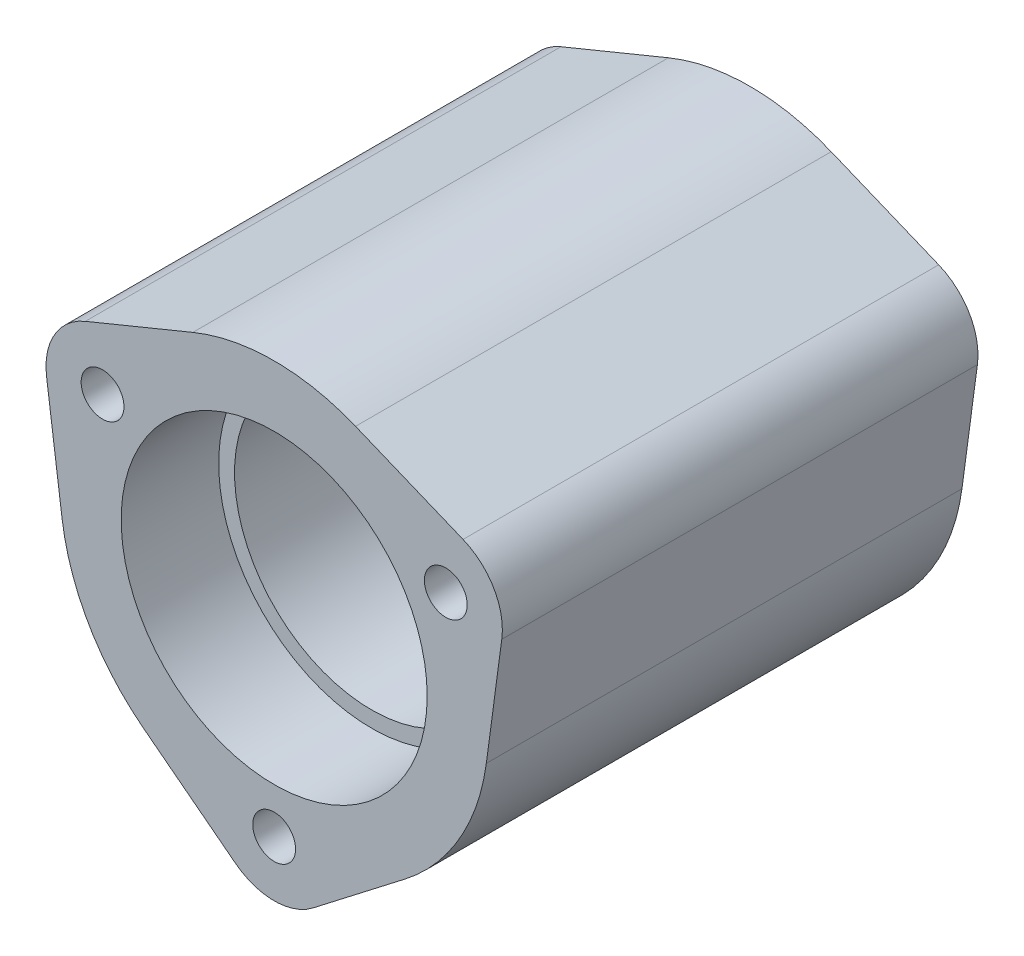
ISO-10303-21;
HEADER;
FILE_DESCRIPTION(('STEP AP214'),'2;1');
FILE_NAME('part.step','',(''),(''),'','','');
FILE_SCHEMA(('AUTOMOTIVE_DESIGN { 1 0 10303 214 1 1 1 1 }'));
ENDSEC;
DATA;
#1=APPLICATION_CONTEXT('core data for automotive mechanical design processes');
#2=APPLICATION_PROTOCOL_DEFINITION('international standard','automotive_design',2000,#1);
#3=PRODUCT_CONTEXT('',#1,'mechanical');
#4=PRODUCT('Part','Part','',(#3));
#5=PRODUCT_RELATED_PRODUCT_CATEGORY('part','',(#4));
#6=PRODUCT_DEFINITION_FORMATION('','',#4);
#7=PRODUCT_DEFINITION_CONTEXT('part definition',#1,'design');
#8=PRODUCT_DEFINITION('design','',#6,#7);
#9=PRODUCT_DEFINITION_SHAPE('','',#8);
#10=(LENGTH_UNIT() NAMED_UNIT(*) SI_UNIT(.MILLI.,.METRE.));
#11=(NAMED_UNIT(*) PLANE_ANGLE_UNIT() SI_UNIT($,.RADIAN.));
#12=(NAMED_UNIT(*) SI_UNIT($,.STERADIAN.) SOLID_ANGLE_UNIT());
#13=UNCERTAINTY_MEASURE_WITH_UNIT(LENGTH_MEASURE(1.E-05),#10,'distance_accuracy_value','');
#14=(GEOMETRIC_REPRESENTATION_CONTEXT(3) GLOBAL_UNCERTAINTY_ASSIGNED_CONTEXT((#13)) GLOBAL_UNIT_ASSIGNED_CONTEXT((#10,
#11,#12)) REPRESENTATION_CONTEXT('',''));
#15=CARTESIAN_POINT('',(0.,0.,0.));
#16=DIRECTION('',(0.,0.,1.));
#17=DIRECTION('',(1.,0.,0.));
#18=AXIS2_PLACEMENT_3D('',#15,#16,#17);
#19=CARTESIAN_POINT('',(0.,0.,15.));
#20=DIRECTION('',(0.,0.,-1.));
#21=DIRECTION('',(-1.,0.,0.));
#22=AXIS2_PLACEMENT_3D('',#19,#20,#21);
#23=CYLINDRICAL_SURFACE('',#22,13.5);
#24=CARTESIAN_POINT('',(0.,0.,-15.));
#25=DIRECTION('',(0.,0.,1.));
#26=DIRECTION('',(1.,0.,0.));
#27=AXIS2_PLACEMENT_3D('',#24,#25,#26);
#28=CIRCLE('',#27,13.5);
#29=CARTESIAN_POINT('',(-13.3795810244317,-1.79911411830017,-15.));
#30=VERTEX_POINT('',#29);
#31=CARTESIAN_POINT('',(-8.24786904297104,-10.6875,-15.));
#32=VERTEX_POINT('',#31);
#33=EDGE_CURVE('E156',#30,#32,#28,.T.);
#34=ORIENTED_EDGE('',*,*,#33,.T.);
#35=DIRECTION('',(0.,0.,-1.));
#36=VECTOR('',#35,1.);
#37=CARTESIAN_POINT('',(-8.24786904297104,-10.6875,15.));
#38=LINE('',#37,#36);
#39=CARTESIAN_POINT('',(-8.24786904297104,-10.6875,15.));
#40=VERTEX_POINT('',#39);
#41=EDGE_CURVE('E11',#40,#32,#38,.T.);
#42=ORIENTED_EDGE('',*,*,#41,.F.);
#43=CARTESIAN_POINT('',(0.,0.,15.));
#44=DIRECTION('',(0.,0.,1.));
#45=DIRECTION('',(1.,0.,0.));
#46=AXIS2_PLACEMENT_3D('',#43,#44,#45);
#47=CIRCLE('',#46,13.5);
#48=CARTESIAN_POINT('',(-13.3795810244317,-1.79911411830017,15.));
#49=VERTEX_POINT('',#48);
#50=EDGE_CURVE('E179',#49,#40,#47,.T.);
#51=ORIENTED_EDGE('',*,*,#50,.F.);
#52=DIRECTION('',(0.,0.,-1.));
#53=VECTOR('',#52,1.);
#54=CARTESIAN_POINT('',(-13.3795810244317,-1.79911411830017,15.));
#55=LINE('',#54,#53);
#56=EDGE_CURVE('E152',#49,#30,#55,.T.);
#57=ORIENTED_EDGE('',*,*,#56,.T.);
#58=EDGE_LOOP('',(#34,#42,#51,#57));
#59=FACE_BOUND('',#58,.T.);
#60=ADVANCED_FACE('F35',(#59),#23,.T.);
#61=CARTESIAN_POINT('',(-2.4438130497692,-15.1666666666667,15.));
#62=DIRECTION('',(0.610953262442299,0.791666666666667,0.));
#63=DIRECTION('',(-0.791666666666667,0.610953262442299,0.));
#64=AXIS2_PLACEMENT_3D('',#61,#62,#63);
#65=PLANE('',#64);
#66=DIRECTION('',(0.791666666666667,-0.610953262442299,0.));
#67=VECTOR('',#66,1.);
#68=CARTESIAN_POINT('',(-2.4438130497692,-15.1666666666667,-15.));
#69=LINE('',#68,#67);
#70=CARTESIAN_POINT('',(-2.44381304976919,-15.1666666666667,-15.));
#71=VERTEX_POINT('',#70);
#72=EDGE_CURVE('E159',#32,#71,#69,.T.);
#73=ORIENTED_EDGE('',*,*,#72,.T.);
#74=DIRECTION('',(0.,0.,-1.));
#75=VECTOR('',#74,1.);
#76=CARTESIAN_POINT('',(-2.44381304976919,-15.1666666666667,15.));
#77=LINE('',#76,#75);
#78=CARTESIAN_POINT('',(-2.44381304976919,-15.1666666666667,15.));
#79=VERTEX_POINT('',#78);
#80=EDGE_CURVE('E44',#79,#71,#77,.T.);
#81=ORIENTED_EDGE('',*,*,#80,.F.);
#82=DIRECTION('',(0.791666666666667,-0.610953262442299,0.));
#83=VECTOR('',#82,1.);
#84=CARTESIAN_POINT('',(-2.4438130497692,-15.1666666666667,15.));
#85=LINE('',#84,#83);
#86=EDGE_CURVE('E107',#40,#79,#85,.T.);
#87=ORIENTED_EDGE('',*,*,#86,.F.);
#88=ORIENTED_EDGE('',*,*,#41,.T.);
#89=EDGE_LOOP('',(#73,#81,#87,#88));
#90=FACE_BOUND('',#89,.T.);
#91=ADVANCED_FACE('F259',(#90),#65,.F.);
#92=CARTESIAN_POINT('',(0.,-12.,15.));
#93=DIRECTION('',(0.,0.,-1.));
#94=DIRECTION('',(-1.,0.,0.));
#95=AXIS2_PLACEMENT_3D('',#92,#93,#94);
#96=CYLINDRICAL_SURFACE('',#95,4.);
#97=CARTESIAN_POINT('',(0.,-12.,-15.));
#98=DIRECTION('',(0.,0.,1.));
#99=DIRECTION('',(1.,0.,0.));
#100=AXIS2_PLACEMENT_3D('',#97,#98,#99);
#101=CIRCLE('',#100,4.);
#102=CARTESIAN_POINT('',(2.44381304976919,-15.1666666666667,-15.));
#103=VERTEX_POINT('',#102);
#104=EDGE_CURVE('E162',#71,#103,#101,.T.);
#105=ORIENTED_EDGE('',*,*,#104,.T.);
#106=DIRECTION('',(0.,0.,-1.));
#107=VECTOR('',#106,1.);
#108=CARTESIAN_POINT('',(2.44381304976919,-15.1666666666667,15.));
#109=LINE('',#108,#107);
#110=CARTESIAN_POINT('',(2.44381304976919,-15.1666666666667,15.));
#111=VERTEX_POINT('',#110);
#112=EDGE_CURVE('E198',#111,#103,#109,.T.);
#113=ORIENTED_EDGE('',*,*,#112,.F.);
#114=CARTESIAN_POINT('',(0.,-12.,15.));
#115=DIRECTION('',(0.,0.,1.));
#116=DIRECTION('',(1.,0.,0.));
#117=AXIS2_PLACEMENT_3D('',#114,#115,#116);
#118=CIRCLE('',#117,4.);
#119=EDGE_CURVE('E207',#79,#111,#118,.T.);
#120=ORIENTED_EDGE('',*,*,#119,.F.);
#121=ORIENTED_EDGE('',*,*,#80,.T.);
#122=EDGE_LOOP('',(#105,#113,#120,#121));
#123=FACE_BOUND('',#122,.T.);
#124=ADVANCED_FACE('F205',(#123),#96,.T.);
#125=CARTESIAN_POINT('',(2.44381304976919,-15.1666666666667,15.));
#126=DIRECTION('',(-0.610953262442299,0.791666666666667,0.));
#127=DIRECTION('',(-0.791666666666667,-0.610953262442299,0.));
#128=AXIS2_PLACEMENT_3D('',#125,#126,#127);
#129=PLANE('',#128);
#130=DIRECTION('',(0.791666666666667,0.610953262442299,0.));
#131=VECTOR('',#130,1.);
#132=CARTESIAN_POINT('',(2.44381304976919,-15.1666666666667,-15.));
#133=LINE('',#132,#131);
#134=CARTESIAN_POINT('',(8.24786904297104,-10.6875,-15.));
#135=VERTEX_POINT('',#134);
#136=EDGE_CURVE('E164',#103,#135,#133,.T.);
#137=ORIENTED_EDGE('',*,*,#136,.T.);
#138=DIRECTION('',(0.,0.,-1.));
#139=VECTOR('',#138,1.);
#140=CARTESIAN_POINT('',(8.24786904297104,-10.6875,15.));
#141=LINE('',#140,#139);
#142=CARTESIAN_POINT('',(8.24786904297104,-10.6875,15.));
#143=VERTEX_POINT('',#142);
#144=EDGE_CURVE('E195',#143,#135,#141,.T.);
#145=ORIENTED_EDGE('',*,*,#144,.F.);
#146=DIRECTION('',(0.791666666666667,0.610953262442299,0.));
#147=VECTOR('',#146,1.);
#148=CARTESIAN_POINT('',(2.44381304976919,-15.1666666666667,15.));
#149=LINE('',#148,#147);
#150=EDGE_CURVE('E225',#111,#143,#149,.T.);
#151=ORIENTED_EDGE('',*,*,#150,.F.);
#152=ORIENTED_EDGE('',*,*,#112,.T.);
#153=EDGE_LOOP('',(#137,#145,#151,#152));
#154=FACE_BOUND('',#153,.T.);
#155=ADVANCED_FACE('F216',(#154),#129,.F.);
#156=CARTESIAN_POINT('',(0.,0.,15.));
#157=DIRECTION('',(0.,0.,-1.));
#158=DIRECTION('',(-1.,0.,0.));
#159=AXIS2_PLACEMENT_3D('',#156,#157,#158);
#160=CYLINDRICAL_SURFACE('',#159,13.5);
#161=CARTESIAN_POINT('',(0.,0.,-15.));
#162=DIRECTION('',(0.,0.,1.));
#163=DIRECTION('',(1.,0.,0.));
#164=AXIS2_PLACEMENT_3D('',#161,#162,#163);
#165=CIRCLE('',#164,13.5);
#166=CARTESIAN_POINT('',(13.3795810244317,-1.79911411830015,-15.));
#167=VERTEX_POINT('',#166);
#168=EDGE_CURVE('E166',#135,#167,#165,.T.);
#169=ORIENTED_EDGE('',*,*,#168,.T.);
#170=DIRECTION('',(0.,0.,-1.));
#171=VECTOR('',#170,1.);
#172=CARTESIAN_POINT('',(13.3795810244317,-1.79911411830015,15.));
#173=LINE('',#172,#171);
#174=CARTESIAN_POINT('',(13.3795810244317,-1.79911411830015,15.));
#175=VERTEX_POINT('',#174);
#176=EDGE_CURVE('E192',#175,#167,#173,.T.);
#177=ORIENTED_EDGE('',*,*,#176,.F.);
#178=CARTESIAN_POINT('',(0.,0.,15.));
#179=DIRECTION('',(0.,0.,1.));
#180=DIRECTION('',(1.,0.,0.));
#181=AXIS2_PLACEMENT_3D('',#178,#179,#180);
#182=CIRCLE('',#181,13.5);
#183=EDGE_CURVE('E222',#143,#175,#182,.T.);
#184=ORIENTED_EDGE('',*,*,#183,.F.);
#185=ORIENTED_EDGE('',*,*,#144,.T.);
#186=EDGE_LOOP('',(#169,#177,#184,#185));
#187=FACE_BOUND('',#186,.T.);
#188=ADVANCED_FACE('F220',(#187),#160,.T.);
#189=CARTESIAN_POINT('',(14.3566251489486,5.46692915013329,15.));
#190=DIRECTION('',(-0.99108007588383,0.133267712466679,0.));
#191=DIRECTION('',(-0.133267712466679,-0.99108007588383,0.));
#192=AXIS2_PLACEMENT_3D('',#189,#190,#191);
#193=PLANE('',#192);
#194=DIRECTION('',(0.133267712466679,0.99108007588383,0.));
#195=VECTOR('',#194,1.);
#196=CARTESIAN_POINT('',(14.3566251489486,5.46692915013329,-15.));
#197=LINE('',#196,#195);
#198=CARTESIAN_POINT('',(14.3566251489486,5.46692915013329,-15.));
#199=VERTEX_POINT('',#198);
#200=EDGE_CURVE('E168',#167,#199,#197,.T.);
#201=ORIENTED_EDGE('',*,*,#200,.T.);
#202=DIRECTION('',(0.,0.,-1.));
#203=VECTOR('',#202,1.);
#204=CARTESIAN_POINT('',(14.3566251489486,5.46692915013329,15.));
#205=LINE('',#204,#203);
#206=CARTESIAN_POINT('',(14.3566251489486,5.46692915013329,15.));
#207=VERTEX_POINT('',#206);
#208=EDGE_CURVE('E189',#207,#199,#205,.T.);
#209=ORIENTED_EDGE('',*,*,#208,.F.);
#210=DIRECTION('',(0.133267712466679,0.99108007588383,0.));
#211=VECTOR('',#210,1.);
#212=CARTESIAN_POINT('',(14.3566251489486,5.46692915013329,15.));
#213=LINE('',#212,#211);
#214=EDGE_CURVE('E224',#175,#207,#213,.T.);
#215=ORIENTED_EDGE('',*,*,#214,.F.);
#216=ORIENTED_EDGE('',*,*,#176,.T.);
#217=EDGE_LOOP('',(#201,#209,#215,#216));
#218=FACE_BOUND('',#217,.T.);
#219=ADVANCED_FACE('F272',(#218),#193,.F.);
#220=CARTESIAN_POINT('',(10.3923048454133,6.00000000000001,15.));
#221=DIRECTION('',(0.,0.,-1.));
#222=DIRECTION('',(-1.,0.,0.));
#223=AXIS2_PLACEMENT_3D('',#220,#221,#222);
#224=CYLINDRICAL_SURFACE('',#223,4.);
#225=CARTESIAN_POINT('',(10.3923048454133,6.00000000000001,-15.));
#226=DIRECTION('',(0.,0.,1.));
#227=DIRECTION('',(1.,0.,0.));
#228=AXIS2_PLACEMENT_3D('',#225,#226,#227);
#229=CIRCLE('',#228,4.);
#230=CARTESIAN_POINT('',(11.9128120991794,9.69973751653338,-15.));
#231=VERTEX_POINT('',#230);
#232=EDGE_CURVE('E170',#199,#231,#229,.T.);
#233=ORIENTED_EDGE('',*,*,#232,.T.);
#234=DIRECTION('',(0.,0.,-1.));
#235=VECTOR('',#234,1.);
#236=CARTESIAN_POINT('',(11.9128120991794,9.69973751653338,15.));
#237=LINE('',#236,#235);
#238=CARTESIAN_POINT('',(11.9128120991794,9.69973751653338,15.));
#239=VERTEX_POINT('',#238);
#240=EDGE_CURVE('E186',#239,#231,#237,.T.);
#241=ORIENTED_EDGE('',*,*,#240,.F.);
#242=CARTESIAN_POINT('',(10.3923048454133,6.00000000000001,15.));
#243=DIRECTION('',(0.,0.,1.));
#244=DIRECTION('',(1.,0.,0.));
#245=AXIS2_PLACEMENT_3D('',#242,#243,#244);
#246=CIRCLE('',#245,4.);
#247=EDGE_CURVE('E227',#207,#239,#246,.T.);
#248=ORIENTED_EDGE('',*,*,#247,.F.);
#249=ORIENTED_EDGE('',*,*,#208,.T.);
#250=EDGE_LOOP('',(#233,#241,#248,#249));
#251=FACE_BOUND('',#250,.T.);
#252=ADVANCED_FACE('F275',(#251),#224,.T.);
#253=CARTESIAN_POINT('',(11.9128120991794,9.69973751653338,15.));
#254=DIRECTION('',(-0.380126813441531,-0.924934379133346,0.));
#255=DIRECTION('',(0.924934379133346,-0.380126813441531,0.));
#256=AXIS2_PLACEMENT_3D('',#253,#254,#255);
#257=PLANE('',#256);
#258=DIRECTION('',(-0.924934379133346,0.380126813441531,0.));
#259=VECTOR('',#258,1.);
#260=CARTESIAN_POINT('',(11.9128120991794,9.69973751653338,-15.));
#261=LINE('',#260,#259);
#262=CARTESIAN_POINT('',(5.13171198146066,12.4866141183002,-15.));
#263=VERTEX_POINT('',#262);
#264=EDGE_CURVE('E172',#231,#263,#261,.T.);
#265=ORIENTED_EDGE('',*,*,#264,.T.);
#266=DIRECTION('',(0.,0.,-1.));
#267=VECTOR('',#266,1.);
#268=CARTESIAN_POINT('',(5.13171198146066,12.4866141183002,15.));
#269=LINE('',#268,#267);
#270=CARTESIAN_POINT('',(5.13171198146066,12.4866141183002,15.));
#271=VERTEX_POINT('',#270);
#272=EDGE_CURVE('E183',#271,#263,#269,.T.);
#273=ORIENTED_EDGE('',*,*,#272,.F.);
#274=DIRECTION('',(-0.924934379133346,0.380126813441531,0.));
#275=VECTOR('',#274,1.);
#276=CARTESIAN_POINT('',(11.9128120991794,9.69973751653338,15.));
#277=LINE('',#276,#275);
#278=EDGE_CURVE('E233',#239,#271,#277,.T.);
#279=ORIENTED_EDGE('',*,*,#278,.F.);
#280=ORIENTED_EDGE('',*,*,#240,.T.);
#281=EDGE_LOOP('',(#265,#273,#279,#280));
#282=FACE_BOUND('',#281,.T.);
#283=ADVANCED_FACE('F239',(#282),#257,.F.);
#284=CARTESIAN_POINT('',(0.,0.,15.));
#285=DIRECTION('',(0.,0.,-1.));
#286=DIRECTION('',(-1.,0.,0.));
#287=AXIS2_PLACEMENT_3D('',#284,#285,#286);
#288=CYLINDRICAL_SURFACE('',#287,13.5);
#289=CARTESIAN_POINT('',(0.,0.,-15.));
#290=DIRECTION('',(0.,0.,1.));
#291=DIRECTION('',(1.,0.,0.));
#292=AXIS2_PLACEMENT_3D('',#289,#290,#291);
#293=CIRCLE('',#292,13.5);
#294=CARTESIAN_POINT('',(-5.13171198146067,12.4866141183002,-15.));
#295=VERTEX_POINT('',#294);
#296=EDGE_CURVE('E174',#263,#295,#293,.T.);
#297=ORIENTED_EDGE('',*,*,#296,.T.);
#298=DIRECTION('',(0.,0.,-1.));
#299=VECTOR('',#298,1.);
#300=CARTESIAN_POINT('',(-5.13171198146067,12.4866141183002,15.));
#301=LINE('',#300,#299);
#302=CARTESIAN_POINT('',(-5.13171198146067,12.4866141183002,15.));
#303=VERTEX_POINT('',#302);
#304=EDGE_CURVE('E147',#303,#295,#301,.T.);
#305=ORIENTED_EDGE('',*,*,#304,.F.);
#306=CARTESIAN_POINT('',(0.,0.,15.));
#307=DIRECTION('',(0.,0.,1.));
#308=DIRECTION('',(1.,0.,0.));
#309=AXIS2_PLACEMENT_3D('',#306,#307,#308);
#310=CIRCLE('',#309,13.5);
#311=EDGE_CURVE('E138',#271,#303,#310,.T.);
#312=ORIENTED_EDGE('',*,*,#311,.F.);
#313=ORIENTED_EDGE('',*,*,#272,.T.);
#314=EDGE_LOOP('',(#297,#305,#312,#313));
#315=FACE_BOUND('',#314,.T.);
#316=ADVANCED_FACE('F243',(#315),#288,.T.);
#317=CARTESIAN_POINT('',(-11.9128120991794,9.69973751653338,15.));
#318=DIRECTION('',(0.380126813441531,-0.924934379133345,0.));
#319=DIRECTION('',(0.924934379133345,0.380126813441531,0.));
#320=AXIS2_PLACEMENT_3D('',#317,#318,#319);
#321=PLANE('',#320);
#322=DIRECTION('',(-0.924934379133345,-0.380126813441531,0.));
#323=VECTOR('',#322,1.);
#324=CARTESIAN_POINT('',(-11.9128120991794,9.69973751653338,-15.));
#325=LINE('',#324,#323);
#326=CARTESIAN_POINT('',(-11.9128120991794,9.69973751653338,-15.));
#327=VERTEX_POINT('',#326);
#328=EDGE_CURVE('E146',#295,#327,#325,.T.);
#329=ORIENTED_EDGE('',*,*,#328,.T.);
#330=DIRECTION('',(0.,0.,-1.));
#331=VECTOR('',#330,1.);
#332=CARTESIAN_POINT('',(-11.9128120991794,9.69973751653338,15.));
#333=LINE('',#332,#331);
#334=CARTESIAN_POINT('',(-11.9128120991794,9.69973751653338,15.));
#335=VERTEX_POINT('',#334);
#336=EDGE_CURVE('E143',#335,#327,#333,.T.);
#337=ORIENTED_EDGE('',*,*,#336,.F.);
#338=DIRECTION('',(-0.924934379133345,-0.380126813441531,0.));
#339=VECTOR('',#338,1.);
#340=CARTESIAN_POINT('',(-11.9128120991794,9.69973751653338,15.));
#341=LINE('',#340,#339);
#342=EDGE_CURVE('E132',#303,#335,#341,.T.);
#343=ORIENTED_EDGE('',*,*,#342,.F.);
#344=ORIENTED_EDGE('',*,*,#304,.T.);
#345=EDGE_LOOP('',(#329,#337,#343,#344));
#346=FACE_BOUND('',#345,.T.);
#347=ADVANCED_FACE('F144',(#346),#321,.F.);
#348=CARTESIAN_POINT('',(-10.3923048454133,6.,15.));
#349=DIRECTION('',(0.,0.,-1.));
#350=DIRECTION('',(-1.,0.,0.));
#351=AXIS2_PLACEMENT_3D('',#348,#349,#350);
#352=CYLINDRICAL_SURFACE('',#351,3.99999999999999);
#353=CARTESIAN_POINT('',(-10.3923048454133,6.,-15.));
#354=DIRECTION('',(0.,0.,1.));
#355=DIRECTION('',(1.,0.,0.));
#356=AXIS2_PLACEMENT_3D('',#353,#354,#355);
#357=CIRCLE('',#356,3.99999999999999);
#358=CARTESIAN_POINT('',(-14.3566251489486,5.46692915013328,-15.));
#359=VERTEX_POINT('',#358);
#360=EDGE_CURVE('E93',#327,#359,#357,.T.);
#361=ORIENTED_EDGE('',*,*,#360,.T.);
#362=DIRECTION('',(0.,0.,-1.));
#363=VECTOR('',#362,1.);
#364=CARTESIAN_POINT('',(-14.3566251489486,5.46692915013328,15.));
#365=LINE('',#364,#363);
#366=CARTESIAN_POINT('',(-14.3566251489486,5.46692915013328,15.));
#367=VERTEX_POINT('',#366);
#368=EDGE_CURVE('E148',#367,#359,#365,.T.);
#369=ORIENTED_EDGE('',*,*,#368,.F.);
#370=CARTESIAN_POINT('',(-10.3923048454133,6.,15.));
#371=DIRECTION('',(0.,0.,1.));
#372=DIRECTION('',(1.,0.,0.));
#373=AXIS2_PLACEMENT_3D('',#370,#371,#372);
#374=CIRCLE('',#373,3.99999999999999);
#375=EDGE_CURVE('E136',#335,#367,#374,.T.);
#376=ORIENTED_EDGE('',*,*,#375,.F.);
#377=ORIENTED_EDGE('',*,*,#336,.T.);
#378=EDGE_LOOP('',(#361,#369,#376,#377));
#379=FACE_BOUND('',#378,.T.);
#380=ADVANCED_FACE('F150',(#379),#352,.T.);
#381=CARTESIAN_POINT('',(-14.3566251489486,5.46692915013328,15.));
#382=DIRECTION('',(0.99108007588383,0.133267712466678,0.));
#383=DIRECTION('',(-0.133267712466679,0.99108007588383,0.));
#384=AXIS2_PLACEMENT_3D('',#381,#382,#383);
#385=PLANE('',#384);
#386=DIRECTION('',(0.133267712466678,-0.99108007588383,0.));
#387=VECTOR('',#386,1.);
#388=CARTESIAN_POINT('',(-14.3566251489486,5.46692915013328,-15.));
#389=LINE('',#388,#387);
#390=EDGE_CURVE('E99',#359,#30,#389,.T.);
#391=ORIENTED_EDGE('',*,*,#390,.T.);
#392=ORIENTED_EDGE('',*,*,#56,.F.);
#393=DIRECTION('',(0.133267712466678,-0.99108007588383,0.));
#394=VECTOR('',#393,1.);
#395=CARTESIAN_POINT('',(-14.3566251489486,5.46692915013328,15.));
#396=LINE('',#395,#394);
#397=EDGE_CURVE('E52',#367,#49,#396,.T.);
#398=ORIENTED_EDGE('',*,*,#397,.F.);
#399=ORIENTED_EDGE('',*,*,#368,.T.);
#400=EDGE_LOOP('',(#391,#392,#398,#399));
#401=FACE_BOUND('',#400,.T.);
#402=ADVANCED_FACE('F247',(#401),#385,.F.);
#403=CARTESIAN_POINT('',(0.,0.,15.));
#404=DIRECTION('',(0.,0.,1.));
#405=DIRECTION('',(1.,0.,0.));
#406=AXIS2_PLACEMENT_3D('',#403,#404,#405);
#407=PLANE('',#406);
#408=CARTESIAN_POINT('',(-10.8253175473055,6.25,15.));
#409=DIRECTION('',(0.,0.,1.));
#410=DIRECTION('',(1.,0.,0.));
#411=AXIS2_PLACEMENT_3D('',#408,#409,#410);
#412=CIRCLE('',#411,1.35);
#413=CARTESIAN_POINT('',(-9.47531754730548,6.25,15.));
#414=VERTEX_POINT('',#413);
#415=EDGE_CURVE('E513',#414,#414,#412,.T.);
#416=ORIENTED_EDGE('',*,*,#415,.F.);
#417=EDGE_LOOP('',(#416));
#418=FACE_BOUND('',#417,.T.);
#419=CARTESIAN_POINT('',(10.8253175473055,6.25000000000001,15.));
#420=DIRECTION('',(0.,0.,1.));
#421=DIRECTION('',(1.,0.,0.));
#422=AXIS2_PLACEMENT_3D('',#419,#420,#421);
#423=CIRCLE('',#422,1.35);
#424=CARTESIAN_POINT('',(12.1753175473055,6.25000000000001,15.));
#425=VERTEX_POINT('',#424);
#426=EDGE_CURVE('E488',#425,#425,#423,.T.);
#427=ORIENTED_EDGE('',*,*,#426,.F.);
#428=EDGE_LOOP('',(#427));
#429=FACE_BOUND('',#428,.T.);
#430=CARTESIAN_POINT('',(0.,-12.5,15.));
#431=DIRECTION('',(0.,0.,1.));
#432=DIRECTION('',(1.,0.,0.));
#433=AXIS2_PLACEMENT_3D('',#430,#431,#432);
#434=CIRCLE('',#433,1.35);
#435=CARTESIAN_POINT('',(1.35,-12.5,15.));
#436=VERTEX_POINT('',#435);
#437=EDGE_CURVE('E512',#436,#436,#434,.T.);
#438=ORIENTED_EDGE('',*,*,#437,.F.);
#439=EDGE_LOOP('',(#438));
#440=FACE_BOUND('',#439,.T.);
#441=CARTESIAN_POINT('',(0.,0.,15.));
#442=DIRECTION('',(0.,0.,1.));
#443=DIRECTION('',(1.,0.,0.));
#444=AXIS2_PLACEMENT_3D('',#441,#442,#443);
#445=CIRCLE('',#444,9.65);
#446=CARTESIAN_POINT('',(9.65,0.,15.));
#447=VERTEX_POINT('',#446);
#448=EDGE_CURVE('E529',#447,#447,#445,.T.);
#449=ORIENTED_EDGE('',*,*,#448,.F.);
#450=EDGE_LOOP('',(#449));
#451=FACE_BOUND('',#450,.T.);
#452=ORIENTED_EDGE('',*,*,#50,.T.);
#453=ORIENTED_EDGE('',*,*,#86,.T.);
#454=ORIENTED_EDGE('',*,*,#119,.T.);
#455=ORIENTED_EDGE('',*,*,#150,.T.);
#456=ORIENTED_EDGE('',*,*,#183,.T.);
#457=ORIENTED_EDGE('',*,*,#214,.T.);
#458=ORIENTED_EDGE('',*,*,#247,.T.);
#459=ORIENTED_EDGE('',*,*,#278,.T.);
#460=ORIENTED_EDGE('',*,*,#311,.T.);
#461=ORIENTED_EDGE('',*,*,#342,.T.);
#462=ORIENTED_EDGE('',*,*,#375,.T.);
#463=ORIENTED_EDGE('',*,*,#397,.T.);
#464=EDGE_LOOP('',(#452,#453,#454,#455,#456,#457,#458,#459,#460,#461,#462,#463));
#465=FACE_BOUND('',#464,.T.);
#466=ADVANCED_FACE('F134',(#418,#429,#440,#451,#465),#407,.T.);
#467=CARTESIAN_POINT('',(0.,0.,-15.));
#468=DIRECTION('',(0.,0.,1.));
#469=DIRECTION('',(1.,0.,0.));
#470=AXIS2_PLACEMENT_3D('',#467,#468,#469);
#471=PLANE('',#470);
#472=CARTESIAN_POINT('',(0.,-12.5,-15.));
#473=DIRECTION('',(0.,0.,1.));
#474=DIRECTION('',(1.,0.,0.));
#475=AXIS2_PLACEMENT_3D('',#472,#473,#474);
#476=CIRCLE('',#475,1.35);
#477=CARTESIAN_POINT('',(1.35,-12.5,-15.));
#478=VERTEX_POINT('',#477);
#479=EDGE_CURVE('E489',#478,#478,#476,.T.);
#480=ORIENTED_EDGE('',*,*,#479,.T.);
#481=EDGE_LOOP('',(#480));
#482=FACE_BOUND('',#481,.T.);
#483=CARTESIAN_POINT('',(-10.8253175473055,6.25,-15.));
#484=DIRECTION('',(0.,0.,1.));
#485=DIRECTION('',(1.,0.,0.));
#486=AXIS2_PLACEMENT_3D('',#483,#484,#485);
#487=CIRCLE('',#486,1.35);
#488=CARTESIAN_POINT('',(-9.47531754730548,6.25,-15.));
#489=VERTEX_POINT('',#488);
#490=EDGE_CURVE('E500',#489,#489,#487,.T.);
#491=ORIENTED_EDGE('',*,*,#490,.T.);
#492=EDGE_LOOP('',(#491));
#493=FACE_BOUND('',#492,.T.);
#494=CARTESIAN_POINT('',(10.8253175473055,6.25000000000001,-15.));
#495=DIRECTION('',(0.,0.,1.));
#496=DIRECTION('',(1.,0.,0.));
#497=AXIS2_PLACEMENT_3D('',#494,#495,#496);
#498=CIRCLE('',#497,1.35);
#499=CARTESIAN_POINT('',(12.1753175473055,6.25000000000001,-15.));
#500=VERTEX_POINT('',#499);
#501=EDGE_CURVE('E506',#500,#500,#498,.T.);
#502=ORIENTED_EDGE('',*,*,#501,.T.);
#503=EDGE_LOOP('',(#502));
#504=FACE_BOUND('',#503,.T.);
#505=CARTESIAN_POINT('',(0.,0.,-15.));
#506=DIRECTION('',(0.,0.,1.));
#507=DIRECTION('',(1.,0.,0.));
#508=AXIS2_PLACEMENT_3D('',#505,#506,#507);
#509=CIRCLE('',#508,9.65);
#510=CARTESIAN_POINT('',(9.65,0.,-15.));
#511=VERTEX_POINT('',#510);
#512=EDGE_CURVE('E530',#511,#511,#509,.T.);
#513=ORIENTED_EDGE('',*,*,#512,.T.);
#514=EDGE_LOOP('',(#513));
#515=FACE_BOUND('',#514,.T.);
#516=ORIENTED_EDGE('',*,*,#33,.F.);
#517=ORIENTED_EDGE('',*,*,#390,.F.);
#518=ORIENTED_EDGE('',*,*,#360,.F.);
#519=ORIENTED_EDGE('',*,*,#328,.F.);
#520=ORIENTED_EDGE('',*,*,#296,.F.);
#521=ORIENTED_EDGE('',*,*,#264,.F.);
#522=ORIENTED_EDGE('',*,*,#232,.F.);
#523=ORIENTED_EDGE('',*,*,#200,.F.);
#524=ORIENTED_EDGE('',*,*,#168,.F.);
#525=ORIENTED_EDGE('',*,*,#136,.F.);
#526=ORIENTED_EDGE('',*,*,#104,.F.);
#527=ORIENTED_EDGE('',*,*,#72,.F.);
#528=EDGE_LOOP('',(#516,#517,#518,#519,#520,#521,#522,#523,#524,#525,#526,#527));
#529=FACE_BOUND('',#528,.T.);
#530=ADVANCED_FACE('F211',(#482,#493,#504,#515,#529),#471,.F.);
#531=CARTESIAN_POINT('',(0.,0.,8.85));
#532=DIRECTION('',(0.,0.,1.));
#533=DIRECTION('',(1.,0.,0.));
#534=AXIS2_PLACEMENT_3D('',#531,#532,#533);
#535=CYLINDRICAL_SURFACE('',#534,9.65);
#536=CARTESIAN_POINT('',(0.,0.,8.85));
#537=DIRECTION('',(0.,0.,1.));
#538=DIRECTION('',(1.,0.,0.));
#539=AXIS2_PLACEMENT_3D('',#536,#537,#538);
#540=CIRCLE('',#539,9.65);
#541=CARTESIAN_POINT('',(9.65,0.,8.85));
#542=VERTEX_POINT('',#541);
#543=EDGE_CURVE('E160',#542,#542,#540,.T.);
#544=ORIENTED_EDGE('',*,*,#543,.F.);
#545=EDGE_LOOP('',(#544));
#546=FACE_BOUND('',#545,.T.);
#547=ORIENTED_EDGE('',*,*,#448,.T.);
#548=EDGE_LOOP('',(#547));
#549=FACE_BOUND('',#548,.T.);
#550=ADVANCED_FACE('F303',(#546,#549),#535,.F.);
#551=CARTESIAN_POINT('',(0.,0.,8.85));
#552=DIRECTION('',(0.,0.,1.));
#553=DIRECTION('',(1.,0.,0.));
#554=AXIS2_PLACEMENT_3D('',#551,#552,#553);
#555=PLANE('',#554);
#556=CARTESIAN_POINT('',(0.,0.,8.85));
#557=DIRECTION('',(0.,0.,1.));
#558=DIRECTION('',(1.,0.,0.));
#559=AXIS2_PLACEMENT_3D('',#556,#557,#558);
#560=CIRCLE('',#559,8.65);
#561=CARTESIAN_POINT('',(8.65,0.,8.85));
#562=VERTEX_POINT('',#561);
#563=EDGE_CURVE('E521',#562,#562,#560,.T.);
#564=ORIENTED_EDGE('',*,*,#563,.F.);
#565=EDGE_LOOP('',(#564));
#566=FACE_BOUND('',#565,.T.);
#567=ORIENTED_EDGE('',*,*,#543,.T.);
#568=EDGE_LOOP('',(#567));
#569=FACE_BOUND('',#568,.T.);
#570=ADVANCED_FACE('F308',(#566,#569),#555,.T.);
#571=CARTESIAN_POINT('',(0.,0.,-8.85));
#572=DIRECTION('',(0.,0.,-1.));
#573=DIRECTION('',(-1.,0.,0.));
#574=AXIS2_PLACEMENT_3D('',#571,#572,#573);
#575=CYLINDRICAL_SURFACE('',#574,9.65);
#576=CARTESIAN_POINT('',(0.,0.,-8.85));
#577=DIRECTION('',(0.,0.,1.));
#578=DIRECTION('',(1.,0.,0.));
#579=AXIS2_PLACEMENT_3D('',#576,#577,#578);
#580=CIRCLE('',#579,9.65);
#581=CARTESIAN_POINT('',(9.65,0.,-8.85));
#582=VERTEX_POINT('',#581);
#583=EDGE_CURVE('E526',#582,#582,#580,.T.);
#584=ORIENTED_EDGE('',*,*,#583,.T.);
#585=EDGE_LOOP('',(#584));
#586=FACE_BOUND('',#585,.T.);
#587=ORIENTED_EDGE('',*,*,#512,.F.);
#588=EDGE_LOOP('',(#587));
#589=FACE_BOUND('',#588,.T.);
#590=ADVANCED_FACE('F318',(#586,#589),#575,.F.);
#591=CARTESIAN_POINT('',(0.,0.,-8.85));
#592=DIRECTION('',(0.,0.,-1.));
#593=DIRECTION('',(1.,0.,0.));
#594=AXIS2_PLACEMENT_3D('',#591,#592,#593);
#595=PLANE('',#594);
#596=CARTESIAN_POINT('',(0.,0.,-8.85));
#597=DIRECTION('',(0.,0.,-1.));
#598=DIRECTION('',(-1.,0.,0.));
#599=AXIS2_PLACEMENT_3D('',#596,#597,#598);
#600=CIRCLE('',#599,8.65);
#601=CARTESIAN_POINT('',(-8.65,0.,-8.85));
#602=VERTEX_POINT('',#601);
#603=EDGE_CURVE('E38',#602,#602,#600,.T.);
#604=ORIENTED_EDGE('',*,*,#603,.F.);
#605=EDGE_LOOP('',(#604));
#606=FACE_BOUND('',#605,.T.);
#607=ORIENTED_EDGE('',*,*,#583,.F.);
#608=EDGE_LOOP('',(#607));
#609=FACE_BOUND('',#608,.T.);
#610=ADVANCED_FACE('F323',(#606,#609),#595,.T.);
#611=CARTESIAN_POINT('',(0.,0.,-15.));
#612=DIRECTION('',(0.,0.,1.));
#613=DIRECTION('',(1.,0.,0.));
#614=AXIS2_PLACEMENT_3D('',#611,#612,#613);
#615=CYLINDRICAL_SURFACE('',#614,8.65);
#616=ORIENTED_EDGE('',*,*,#603,.T.);
#617=EDGE_LOOP('',(#616));
#618=FACE_BOUND('',#617,.T.);
#619=ORIENTED_EDGE('',*,*,#563,.T.);
#620=EDGE_LOOP('',(#619));
#621=FACE_BOUND('',#620,.T.);
#622=ADVANCED_FACE('F340',(#618,#621),#615,.F.);
#623=CARTESIAN_POINT('',(0.,-12.5,4.));
#624=DIRECTION('',(0.,0.,1.));
#625=DIRECTION('',(1.,0.,0.));
#626=AXIS2_PLACEMENT_3D('',#623,#624,#625);
#627=CYLINDRICAL_SURFACE('',#626,1.35);
#628=CARTESIAN_POINT('',(0.,-12.5,4.));
#629=DIRECTION('',(0.,0.,1.));
#630=DIRECTION('',(1.,0.,0.));
#631=AXIS2_PLACEMENT_3D('',#628,#629,#630);
#632=CIRCLE('',#631,1.35);
#633=CARTESIAN_POINT('',(1.35,-12.5,4.));
#634=VERTEX_POINT('',#633);
#635=EDGE_CURVE('E518',#634,#634,#632,.T.);
#636=ORIENTED_EDGE('',*,*,#635,.F.);
#637=EDGE_LOOP('',(#636));
#638=FACE_BOUND('',#637,.T.);
#639=ORIENTED_EDGE('',*,*,#437,.T.);
#640=EDGE_LOOP('',(#639));
#641=FACE_BOUND('',#640,.T.);
#642=ADVANCED_FACE('F350',(#638,#641),#627,.F.);
#643=CARTESIAN_POINT('',(0.,-12.5,4.));
#644=DIRECTION('',(0.,0.,1.));
#645=DIRECTION('',(1.,0.,0.));
#646=AXIS2_PLACEMENT_3D('',#643,#644,#645);
#647=PLANE('',#646);
#648=ORIENTED_EDGE('',*,*,#635,.T.);
#649=EDGE_LOOP('',(#648));
#650=FACE_BOUND('',#649,.T.);
#651=ADVANCED_FACE('F365',(#650),#647,.T.);
#652=CARTESIAN_POINT('',(10.8253175473055,6.25000000000001,4.));
#653=DIRECTION('',(0.,0.,1.));
#654=DIRECTION('',(1.,0.,0.));
#655=AXIS2_PLACEMENT_3D('',#652,#653,#654);
#656=CYLINDRICAL_SURFACE('',#655,1.35);
#657=CARTESIAN_POINT('',(10.8253175473055,6.25000000000001,4.));
#658=DIRECTION('',(0.,0.,1.));
#659=DIRECTION('',(1.,0.,0.));
#660=AXIS2_PLACEMENT_3D('',#657,#658,#659);
#661=CIRCLE('',#660,1.35);
#662=CARTESIAN_POINT('',(12.1753175473055,6.25000000000001,4.));
#663=VERTEX_POINT('',#662);
#664=EDGE_CURVE('E492',#663,#663,#661,.T.);
#665=ORIENTED_EDGE('',*,*,#664,.F.);
#666=EDGE_LOOP('',(#665));
#667=FACE_BOUND('',#666,.T.);
#668=ORIENTED_EDGE('',*,*,#426,.T.);
#669=EDGE_LOOP('',(#668));
#670=FACE_BOUND('',#669,.T.);
#671=ADVANCED_FACE('F375',(#667,#670),#656,.F.);
#672=CARTESIAN_POINT('',(10.8253175473055,6.25000000000001,4.));
#673=DIRECTION('',(0.,0.,1.));
#674=DIRECTION('',(1.,0.,0.));
#675=AXIS2_PLACEMENT_3D('',#672,#673,#674);
#676=PLANE('',#675);
#677=ORIENTED_EDGE('',*,*,#664,.T.);
#678=EDGE_LOOP('',(#677));
#679=FACE_BOUND('',#678,.T.);
#680=ADVANCED_FACE('F385',(#679),#676,.T.);
#681=CARTESIAN_POINT('',(-10.8253175473055,6.25,4.));
#682=DIRECTION('',(0.,0.,1.));
#683=DIRECTION('',(1.,0.,0.));
#684=AXIS2_PLACEMENT_3D('',#681,#682,#683);
#685=CYLINDRICAL_SURFACE('',#684,1.35);
#686=CARTESIAN_POINT('',(-10.8253175473055,6.25,4.));
#687=DIRECTION('',(0.,0.,1.));
#688=DIRECTION('',(1.,0.,0.));
#689=AXIS2_PLACEMENT_3D('',#686,#687,#688);
#690=CIRCLE('',#689,1.35);
#691=CARTESIAN_POINT('',(-9.47531754730548,6.25,4.));
#692=VERTEX_POINT('',#691);
#693=EDGE_CURVE('E509',#692,#692,#690,.T.);
#694=ORIENTED_EDGE('',*,*,#693,.F.);
#695=EDGE_LOOP('',(#694));
#696=FACE_BOUND('',#695,.T.);
#697=ORIENTED_EDGE('',*,*,#415,.T.);
#698=EDGE_LOOP('',(#697));
#699=FACE_BOUND('',#698,.T.);
#700=ADVANCED_FACE('F395',(#696,#699),#685,.F.);
#701=CARTESIAN_POINT('',(-10.8253175473055,6.25,4.));
#702=DIRECTION('',(0.,0.,1.));
#703=DIRECTION('',(1.,0.,0.));
#704=AXIS2_PLACEMENT_3D('',#701,#702,#703);
#705=PLANE('',#704);
#706=ORIENTED_EDGE('',*,*,#693,.T.);
#707=EDGE_LOOP('',(#706));
#708=FACE_BOUND('',#707,.T.);
#709=ADVANCED_FACE('F405',(#708),#705,.T.);
#710=CARTESIAN_POINT('',(10.8253175473055,6.25000000000001,-4.));
#711=DIRECTION('',(0.,0.,-1.));
#712=DIRECTION('',(-1.,0.,0.));
#713=AXIS2_PLACEMENT_3D('',#710,#711,#712);
#714=CYLINDRICAL_SURFACE('',#713,1.35);
#715=CARTESIAN_POINT('',(10.8253175473055,6.25000000000001,-4.));
#716=DIRECTION('',(0.,0.,1.));
#717=DIRECTION('',(1.,0.,0.));
#718=AXIS2_PLACEMENT_3D('',#715,#716,#717);
#719=CIRCLE('',#718,1.35);
#720=CARTESIAN_POINT('',(12.1753175473055,6.25000000000001,-4.));
#721=VERTEX_POINT('',#720);
#722=EDGE_CURVE('E503',#721,#721,#719,.T.);
#723=ORIENTED_EDGE('',*,*,#722,.T.);
#724=EDGE_LOOP('',(#723));
#725=FACE_BOUND('',#724,.T.);
#726=ORIENTED_EDGE('',*,*,#501,.F.);
#727=EDGE_LOOP('',(#726));
#728=FACE_BOUND('',#727,.T.);
#729=ADVANCED_FACE('F415',(#725,#728),#714,.F.);
#730=CARTESIAN_POINT('',(10.8253175473055,6.25000000000001,-4.));
#731=DIRECTION('',(0.,0.,-1.));
#732=DIRECTION('',(1.,0.,0.));
#733=AXIS2_PLACEMENT_3D('',#730,#731,#732);
#734=PLANE('',#733);
#735=ORIENTED_EDGE('',*,*,#722,.F.);
#736=EDGE_LOOP('',(#735));
#737=FACE_BOUND('',#736,.T.);
#738=ADVANCED_FACE('F431',(#737),#734,.T.);
#739=CARTESIAN_POINT('',(-10.8253175473055,6.25,-4.));
#740=DIRECTION('',(0.,0.,-1.));
#741=DIRECTION('',(-1.,0.,0.));
#742=AXIS2_PLACEMENT_3D('',#739,#740,#741);
#743=CYLINDRICAL_SURFACE('',#742,1.35);
#744=CARTESIAN_POINT('',(-10.8253175473055,6.25,-4.));
#745=DIRECTION('',(0.,0.,1.));
#746=DIRECTION('',(1.,0.,0.));
#747=AXIS2_PLACEMENT_3D('',#744,#745,#746);
#748=CIRCLE('',#747,1.35);
#749=CARTESIAN_POINT('',(-9.47531754730548,6.25,-4.));
#750=VERTEX_POINT('',#749);
#751=EDGE_CURVE('E495',#750,#750,#748,.T.);
#752=ORIENTED_EDGE('',*,*,#751,.T.);
#753=EDGE_LOOP('',(#752));
#754=FACE_BOUND('',#753,.T.);
#755=ORIENTED_EDGE('',*,*,#490,.F.);
#756=EDGE_LOOP('',(#755));
#757=FACE_BOUND('',#756,.T.);
#758=ADVANCED_FACE('F441',(#754,#757),#743,.F.);
#759=CARTESIAN_POINT('',(-10.8253175473055,6.25,-4.));
#760=DIRECTION('',(0.,0.,-1.));
#761=DIRECTION('',(1.,0.,0.));
#762=AXIS2_PLACEMENT_3D('',#759,#760,#761);
#763=PLANE('',#762);
#764=ORIENTED_EDGE('',*,*,#751,.F.);
#765=EDGE_LOOP('',(#764));
#766=FACE_BOUND('',#765,.T.);
#767=ADVANCED_FACE('F451',(#766),#763,.T.);
#768=CARTESIAN_POINT('',(0.,-12.5,-4.));
#769=DIRECTION('',(0.,0.,-1.));
#770=DIRECTION('',(-1.,0.,0.));
#771=AXIS2_PLACEMENT_3D('',#768,#769,#770);
#772=CYLINDRICAL_SURFACE('',#771,1.35);
#773=CARTESIAN_POINT('',(0.,-12.5,-4.));
#774=DIRECTION('',(0.,0.,1.));
#775=DIRECTION('',(1.,0.,0.));
#776=AXIS2_PLACEMENT_3D('',#773,#774,#775);
#777=CIRCLE('',#776,1.35);
#778=CARTESIAN_POINT('',(1.35,-12.5,-4.));
#779=VERTEX_POINT('',#778);
#780=EDGE_CURVE('E487',#779,#779,#777,.T.);
#781=ORIENTED_EDGE('',*,*,#780,.T.);
#782=EDGE_LOOP('',(#781));
#783=FACE_BOUND('',#782,.T.);
#784=ORIENTED_EDGE('',*,*,#479,.F.);
#785=EDGE_LOOP('',(#784));
#786=FACE_BOUND('',#785,.T.);
#787=ADVANCED_FACE('F461',(#783,#786),#772,.F.);
#788=CARTESIAN_POINT('',(0.,-12.5,-4.));
#789=DIRECTION('',(0.,0.,-1.));
#790=DIRECTION('',(1.,0.,0.));
#791=AXIS2_PLACEMENT_3D('',#788,#789,#790);
#792=PLANE('',#791);
#793=ORIENTED_EDGE('',*,*,#780,.F.);
#794=EDGE_LOOP('',(#793));
#795=FACE_BOUND('',#794,.T.);
#796=ADVANCED_FACE('F471',(#795),#792,.T.);
#797=CLOSED_SHELL('',(#60,#91,#124,#155,#188,#219,#252,#283,#316,#347,#380,#402,#466,#530,#550,
#570,#590,#610,#622,#642,#651,#671,#680,#700,#709,#729,#738,#758,#767,#787,#796));
#798=MANIFOLD_SOLID_BREP('B2',#797);
#799=ADVANCED_BREP_SHAPE_REPRESENTATION('',(#18,#798),#14);
#800=SHAPE_DEFINITION_REPRESENTATION(#9,#799);
ENDSEC;
END-ISO-10303-21;
